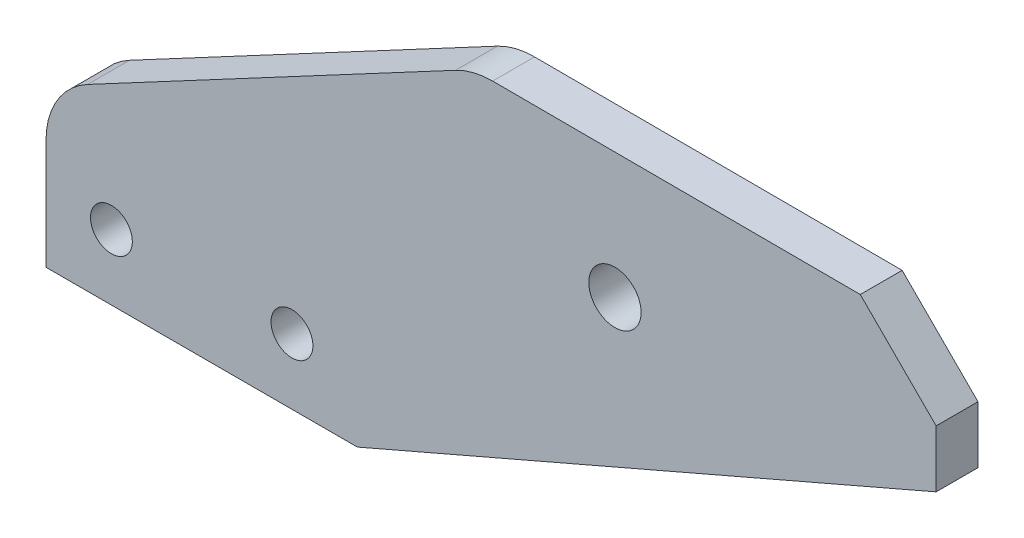
ISO-10303-21;
HEADER;
FILE_DESCRIPTION(('STEP AP214'),'2;1');
FILE_NAME('part.step','',(''),(''),'','','');
FILE_SCHEMA(('AUTOMOTIVE_DESIGN { 1 0 10303 214 1 1 1 1 }'));
ENDSEC;
DATA;
#1=APPLICATION_CONTEXT('core data for automotive mechanical design processes');
#2=APPLICATION_PROTOCOL_DEFINITION('international standard','automotive_design',2000,#1);
#3=PRODUCT_CONTEXT('',#1,'mechanical');
#4=PRODUCT('Part','Part','',(#3));
#5=PRODUCT_RELATED_PRODUCT_CATEGORY('part','',(#4));
#6=PRODUCT_DEFINITION_FORMATION('','',#4);
#7=PRODUCT_DEFINITION_CONTEXT('part definition',#1,'design');
#8=PRODUCT_DEFINITION('design','',#6,#7);
#9=PRODUCT_DEFINITION_SHAPE('','',#8);
#10=(LENGTH_UNIT() NAMED_UNIT(*) SI_UNIT(.MILLI.,.METRE.));
#11=(NAMED_UNIT(*) PLANE_ANGLE_UNIT() SI_UNIT($,.RADIAN.));
#12=(NAMED_UNIT(*) SI_UNIT($,.STERADIAN.) SOLID_ANGLE_UNIT());
#13=UNCERTAINTY_MEASURE_WITH_UNIT(LENGTH_MEASURE(1.E-05),#10,'distance_accuracy_value','');
#14=(GEOMETRIC_REPRESENTATION_CONTEXT(3) GLOBAL_UNCERTAINTY_ASSIGNED_CONTEXT((#13)) GLOBAL_UNIT_ASSIGNED_CONTEXT((#10,
#11,#12)) REPRESENTATION_CONTEXT('',''));
#15=CARTESIAN_POINT('',(0.,0.,0.));
#16=DIRECTION('',(0.,0.,1.));
#17=DIRECTION('',(1.,0.,0.));
#18=AXIS2_PLACEMENT_3D('',#15,#16,#17);
#19=CARTESIAN_POINT('',(0.,0.,-4.064));
#20=DIRECTION('',(0.,-1.,0.));
#21=DIRECTION('',(0.,0.,-1.));
#22=AXIS2_PLACEMENT_3D('',#19,#20,#21);
#23=PLANE('',#22);
#24=DIRECTION('',(1.,0.,0.));
#25=VECTOR('',#24,1.);
#26=CARTESIAN_POINT('',(0.,0.,0.));
#27=LINE('',#26,#25);
#28=CARTESIAN_POINT('',(0.,0.,0.));
#29=VERTEX_POINT('',#28);
#30=CARTESIAN_POINT('',(30.226,0.,0.));
#31=VERTEX_POINT('',#30);
#32=EDGE_CURVE('E142',#29,#31,#27,.T.);
#33=ORIENTED_EDGE('',*,*,#32,.F.);
#34=DIRECTION('',(0.,0.,1.));
#35=VECTOR('',#34,1.);
#36=CARTESIAN_POINT('',(0.,0.,-4.064));
#37=LINE('',#36,#35);
#38=CARTESIAN_POINT('',(0.,0.,-4.064));
#39=VERTEX_POINT('',#38);
#40=EDGE_CURVE('E11',#39,#29,#37,.T.);
#41=ORIENTED_EDGE('',*,*,#40,.F.);
#42=DIRECTION('',(1.,0.,0.));
#43=VECTOR('',#42,1.);
#44=CARTESIAN_POINT('',(0.,0.,-4.064));
#45=LINE('',#44,#43);
#46=CARTESIAN_POINT('',(30.226,0.,-4.064));
#47=VERTEX_POINT('',#46);
#48=EDGE_CURVE('E166',#39,#47,#45,.T.);
#49=ORIENTED_EDGE('',*,*,#48,.T.);
#50=DIRECTION('',(0.,0.,1.));
#51=VECTOR('',#50,1.);
#52=CARTESIAN_POINT('',(30.226,0.,-4.064));
#53=LINE('',#52,#51);
#54=EDGE_CURVE('E42',#47,#31,#53,.T.);
#55=ORIENTED_EDGE('',*,*,#54,.T.);
#56=EDGE_LOOP('',(#33,#41,#49,#55));
#57=FACE_BOUND('',#56,.T.);
#58=ADVANCED_FACE('F39',(#57),#23,.T.);
#59=CARTESIAN_POINT('',(0.,0.,-4.064));
#60=DIRECTION('',(-1.,0.,0.));
#61=DIRECTION('',(0.,0.,1.));
#62=AXIS2_PLACEMENT_3D('',#59,#60,#61);
#63=PLANE('',#62);
#64=DIRECTION('',(0.,-1.,0.));
#65=VECTOR('',#64,1.);
#66=CARTESIAN_POINT('',(0.,0.,0.));
#67=LINE('',#66,#65);
#68=CARTESIAN_POINT('',(0.,10.6678317662414,0.));
#69=VERTEX_POINT('',#68);
#70=EDGE_CURVE('E164',#69,#29,#67,.T.);
#71=ORIENTED_EDGE('',*,*,#70,.F.);
#72=DIRECTION('',(0.,0.,1.));
#73=VECTOR('',#72,1.);
#74=CARTESIAN_POINT('',(0.,10.6678317662414,-4.064));
#75=LINE('',#74,#73);
#76=CARTESIAN_POINT('',(0.,10.6678317662414,-4.064));
#77=VERTEX_POINT('',#76);
#78=EDGE_CURVE('E48',#77,#69,#75,.T.);
#79=ORIENTED_EDGE('',*,*,#78,.F.);
#80=DIRECTION('',(0.,-1.,0.));
#81=VECTOR('',#80,1.);
#82=CARTESIAN_POINT('',(0.,0.,-4.064));
#83=LINE('',#82,#81);
#84=EDGE_CURVE('E132',#77,#39,#83,.T.);
#85=ORIENTED_EDGE('',*,*,#84,.T.);
#86=ORIENTED_EDGE('',*,*,#40,.T.);
#87=EDGE_LOOP('',(#71,#79,#85,#86));
#88=FACE_BOUND('',#87,.T.);
#89=ADVANCED_FACE('F180',(#88),#63,.T.);
#90=CARTESIAN_POINT('',(7.62,10.6678317662414,-4.064));
#91=DIRECTION('',(0.,0.,1.));
#92=DIRECTION('',(1.,0.,0.));
#93=AXIS2_PLACEMENT_3D('',#90,#91,#92);
#94=CYLINDRICAL_SURFACE('',#93,7.62);
#95=CARTESIAN_POINT('',(7.62,10.6678317662414,0.));
#96=DIRECTION('',(0.,0.,1.));
#97=DIRECTION('',(-1.,0.,0.));
#98=AXIS2_PLACEMENT_3D('',#95,#96,#97);
#99=CIRCLE('',#98,7.62);
#100=CARTESIAN_POINT('',(4.03433594322211,17.3914775980748,0.));
#101=VERTEX_POINT('',#100);
#102=EDGE_CURVE('E119',#101,#69,#99,.T.);
#103=ORIENTED_EDGE('',*,*,#102,.F.);
#104=DIRECTION('',(0.,0.,1.));
#105=VECTOR('',#104,1.);
#106=CARTESIAN_POINT('',(4.03433594322211,17.3914775980748,-4.064));
#107=LINE('',#106,#105);
#108=CARTESIAN_POINT('',(4.03433594322211,17.3914775980748,-4.064));
#109=VERTEX_POINT('',#108);
#110=EDGE_CURVE('E114',#109,#101,#107,.T.);
#111=ORIENTED_EDGE('',*,*,#110,.F.);
#112=CARTESIAN_POINT('',(7.62,10.6678317662414,-4.064));
#113=DIRECTION('',(0.,0.,1.));
#114=DIRECTION('',(-1.,0.,0.));
#115=AXIS2_PLACEMENT_3D('',#112,#113,#114);
#116=CIRCLE('',#115,7.62);
#117=EDGE_CURVE('E117',#109,#77,#116,.T.);
#118=ORIENTED_EDGE('',*,*,#117,.T.);
#119=ORIENTED_EDGE('',*,*,#78,.T.);
#120=EDGE_LOOP('',(#103,#111,#118,#119));
#121=FACE_BOUND('',#120,.T.);
#122=ADVANCED_FACE('F116',(#121),#94,.T.);
#123=CARTESIAN_POINT('',(39.7559503073095,36.4415156100357,-4.064));
#124=DIRECTION('',(-0.470559587503661,0.882368219400713,0.));
#125=DIRECTION('',(-0.882368219400713,-0.470559587503661,0.));
#126=AXIS2_PLACEMENT_3D('',#123,#124,#125);
#127=PLANE('',#126);
#128=DIRECTION('',(-0.882368219400713,-0.470559587503661,0.));
#129=VECTOR('',#128,1.);
#130=CARTESIAN_POINT('',(39.7559503073095,36.4415156100357,0.));
#131=LINE('',#130,#129);
#132=CARTESIAN_POINT('',(39.7559503073095,36.4415156100357,0.));
#133=VERTEX_POINT('',#132);
#134=EDGE_CURVE('E161',#133,#101,#131,.T.);
#135=ORIENTED_EDGE('',*,*,#134,.F.);
#136=DIRECTION('',(0.,0.,1.));
#137=VECTOR('',#136,1.);
#138=CARTESIAN_POINT('',(39.7559503073095,36.4415156100357,-4.064));
#139=LINE('',#138,#137);
#140=CARTESIAN_POINT('',(39.7559503073095,36.4415156100357,-4.064));
#141=VERTEX_POINT('',#140);
#142=EDGE_CURVE('E124',#141,#133,#139,.T.);
#143=ORIENTED_EDGE('',*,*,#142,.F.);
#144=DIRECTION('',(-0.882368219400713,-0.470559587503661,0.));
#145=VECTOR('',#144,1.);
#146=CARTESIAN_POINT('',(39.7559503073095,36.4415156100357,-4.064));
#147=LINE('',#146,#145);
#148=EDGE_CURVE('E130',#141,#109,#147,.T.);
#149=ORIENTED_EDGE('',*,*,#148,.T.);
#150=ORIENTED_EDGE('',*,*,#110,.T.);
#151=EDGE_LOOP('',(#135,#143,#149,#150));
#152=FACE_BOUND('',#151,.T.);
#153=ADVANCED_FACE('F134',(#152),#127,.T.);
#154=CARTESIAN_POINT('',(43.3416143640874,29.7178697782022,-4.064));
#155=DIRECTION('',(0.,0.,1.));
#156=DIRECTION('',(1.,0.,0.));
#157=AXIS2_PLACEMENT_3D('',#154,#155,#156);
#158=CYLINDRICAL_SURFACE('',#157,7.62);
#159=CARTESIAN_POINT('',(43.3416143640874,29.7178697782022,0.));
#160=DIRECTION('',(0.,0.,1.));
#161=DIRECTION('',(-1.,0.,0.));
#162=AXIS2_PLACEMENT_3D('',#159,#160,#161);
#163=CIRCLE('',#162,7.62);
#164=CARTESIAN_POINT('',(43.3630430224177,37.337839647736,0.));
#165=VERTEX_POINT('',#164);
#166=EDGE_CURVE('E158',#165,#133,#163,.T.);
#167=ORIENTED_EDGE('',*,*,#166,.F.);
#168=DIRECTION('',(0.,0.,1.));
#169=VECTOR('',#168,1.);
#170=CARTESIAN_POINT('',(43.3630430224177,37.337839647736,-4.064));
#171=LINE('',#170,#169);
#172=CARTESIAN_POINT('',(43.3630430224177,37.337839647736,-4.064));
#173=VERTEX_POINT('',#172);
#174=EDGE_CURVE('E170',#173,#165,#171,.T.);
#175=ORIENTED_EDGE('',*,*,#174,.F.);
#176=CARTESIAN_POINT('',(43.3416143640874,29.7178697782022,-4.064));
#177=DIRECTION('',(0.,0.,1.));
#178=DIRECTION('',(-1.,0.,0.));
#179=AXIS2_PLACEMENT_3D('',#176,#177,#178);
#180=CIRCLE('',#179,7.62);
#181=EDGE_CURVE('E135',#173,#141,#180,.T.);
#182=ORIENTED_EDGE('',*,*,#181,.T.);
#183=ORIENTED_EDGE('',*,*,#142,.T.);
#184=EDGE_LOOP('',(#167,#175,#182,#183));
#185=FACE_BOUND('',#184,.T.);
#186=ADVANCED_FACE('F193',(#185),#158,.T.);
#187=CARTESIAN_POINT('',(79.0464141226986,37.2374919061473,-4.064));
#188=DIRECTION('',(0.00281215988586562,0.999996045870571,0.));
#189=DIRECTION('',(-0.999996045870571,0.00281215988586562,0.));
#190=AXIS2_PLACEMENT_3D('',#187,#188,#189);
#191=PLANE('',#190);
#192=DIRECTION('',(-0.999996045870571,0.00281215988586562,0.));
#193=VECTOR('',#192,1.);
#194=CARTESIAN_POINT('',(79.0464141226986,37.2374919061473,0.));
#195=LINE('',#194,#193);
#196=CARTESIAN_POINT('',(79.0464141226986,37.2374919061473,0.));
#197=VERTEX_POINT('',#196);
#198=EDGE_CURVE('E155',#197,#165,#195,.T.);
#199=ORIENTED_EDGE('',*,*,#198,.F.);
#200=DIRECTION('',(0.,0.,1.));
#201=VECTOR('',#200,1.);
#202=CARTESIAN_POINT('',(79.0464141226986,37.2374919061473,-4.064));
#203=LINE('',#202,#201);
#204=CARTESIAN_POINT('',(79.0464141226986,37.2374919061473,-4.064));
#205=VERTEX_POINT('',#204);
#206=EDGE_CURVE('E172',#205,#197,#203,.T.);
#207=ORIENTED_EDGE('',*,*,#206,.F.);
#208=DIRECTION('',(-0.999996045870571,0.00281215988586562,0.));
#209=VECTOR('',#208,1.);
#210=CARTESIAN_POINT('',(79.0464141226986,37.2374919061473,-4.064));
#211=LINE('',#210,#209);
#212=EDGE_CURVE('E137',#205,#173,#211,.T.);
#213=ORIENTED_EDGE('',*,*,#212,.T.);
#214=ORIENTED_EDGE('',*,*,#174,.T.);
#215=EDGE_LOOP('',(#199,#207,#213,#214));
#216=FACE_BOUND('',#215,.T.);
#217=ADVANCED_FACE('F196',(#216),#191,.T.);
#218=CARTESIAN_POINT('',(86.4102241419753,29.8736818868707,-4.064));
#219=DIRECTION('',(0.707106781186545,0.70710678118655,0.));
#220=DIRECTION('',(-0.70710678118655,0.707106781186545,0.));
#221=AXIS2_PLACEMENT_3D('',#218,#219,#220);
#222=PLANE('',#221);
#223=DIRECTION('',(-0.70710678118655,0.707106781186545,0.));
#224=VECTOR('',#223,1.);
#225=CARTESIAN_POINT('',(86.4102241419753,29.8736818868707,0.));
#226=LINE('',#225,#224);
#227=CARTESIAN_POINT('',(86.4102241419753,29.8736818868707,0.));
#228=VERTEX_POINT('',#227);
#229=EDGE_CURVE('E152',#228,#197,#226,.T.);
#230=ORIENTED_EDGE('',*,*,#229,.F.);
#231=DIRECTION('',(0.,0.,1.));
#232=VECTOR('',#231,1.);
#233=CARTESIAN_POINT('',(86.4102241419753,29.8736818868707,-4.064));
#234=LINE('',#233,#232);
#235=CARTESIAN_POINT('',(86.4102241419753,29.8736818868707,-4.064));
#236=VERTEX_POINT('',#235);
#237=EDGE_CURVE('E174',#236,#228,#234,.T.);
#238=ORIENTED_EDGE('',*,*,#237,.F.);
#239=DIRECTION('',(-0.70710678118655,0.707106781186545,0.));
#240=VECTOR('',#239,1.);
#241=CARTESIAN_POINT('',(86.4102241419753,29.8736818868707,-4.064));
#242=LINE('',#241,#240);
#243=EDGE_CURVE('E259',#236,#205,#242,.T.);
#244=ORIENTED_EDGE('',*,*,#243,.T.);
#245=ORIENTED_EDGE('',*,*,#206,.T.);
#246=EDGE_LOOP('',(#230,#238,#244,#245));
#247=FACE_BOUND('',#246,.T.);
#248=ADVANCED_FACE('F200',(#247),#222,.T.);
#249=CARTESIAN_POINT('',(86.4102241419753,24.3253035912332,-4.064));
#250=DIRECTION('',(1.,0.,0.));
#251=DIRECTION('',(0.,0.,-1.));
#252=AXIS2_PLACEMENT_3D('',#249,#250,#251);
#253=PLANE('',#252);
#254=DIRECTION('',(0.,1.,0.));
#255=VECTOR('',#254,1.);
#256=CARTESIAN_POINT('',(86.4102241419753,24.3253035912332,0.));
#257=LINE('',#256,#255);
#258=CARTESIAN_POINT('',(86.4102241419753,24.3253035912332,0.));
#259=VERTEX_POINT('',#258);
#260=EDGE_CURVE('E149',#259,#228,#257,.T.);
#261=ORIENTED_EDGE('',*,*,#260,.F.);
#262=DIRECTION('',(0.,0.,1.));
#263=VECTOR('',#262,1.);
#264=CARTESIAN_POINT('',(86.4102241419753,24.3253035912332,-4.064));
#265=LINE('',#264,#263);
#266=CARTESIAN_POINT('',(86.4102241419753,24.3253035912332,-4.064));
#267=VERTEX_POINT('',#266);
#268=EDGE_CURVE('E175',#267,#259,#265,.T.);
#269=ORIENTED_EDGE('',*,*,#268,.F.);
#270=DIRECTION('',(0.,1.,0.));
#271=VECTOR('',#270,1.);
#272=CARTESIAN_POINT('',(86.4102241419753,24.3253035912332,-4.064));
#273=LINE('',#272,#271);
#274=EDGE_CURVE('E256',#267,#236,#273,.T.);
#275=ORIENTED_EDGE('',*,*,#274,.T.);
#276=ORIENTED_EDGE('',*,*,#237,.T.);
#277=EDGE_LOOP('',(#261,#269,#275,#276));
#278=FACE_BOUND('',#277,.T.);
#279=ADVANCED_FACE('F204',(#278),#253,.T.);
#280=CARTESIAN_POINT('',(30.226,0.,-4.064));
#281=DIRECTION('',(0.397315979691373,-0.917681868776912,0.));
#282=DIRECTION('',(0.917681868776912,0.397315979691373,0.));
#283=AXIS2_PLACEMENT_3D('',#280,#281,#282);
#284=PLANE('',#283);
#285=DIRECTION('',(0.917681868776911,0.397315979691373,0.));
#286=VECTOR('',#285,1.);
#287=CARTESIAN_POINT('',(30.226,0.,0.));
#288=LINE('',#287,#286);
#289=EDGE_CURVE('E145',#31,#259,#288,.T.);
#290=ORIENTED_EDGE('',*,*,#289,.F.);
#291=ORIENTED_EDGE('',*,*,#54,.F.);
#292=DIRECTION('',(0.917681868776911,0.397315979691373,0.));
#293=VECTOR('',#292,1.);
#294=CARTESIAN_POINT('',(30.226,0.,-4.064));
#295=LINE('',#294,#293);
#296=EDGE_CURVE('E254',#47,#267,#295,.T.);
#297=ORIENTED_EDGE('',*,*,#296,.T.);
#298=ORIENTED_EDGE('',*,*,#268,.T.);
#299=EDGE_LOOP('',(#290,#291,#297,#298));
#300=FACE_BOUND('',#299,.T.);
#301=ADVANCED_FACE('F177',(#300),#284,.T.);
#302=CARTESIAN_POINT('',(43.3416143640874,29.7178697782022,-4.064));
#303=DIRECTION('',(0.,0.,-1.));
#304=DIRECTION('',(-1.,0.,0.));
#305=AXIS2_PLACEMENT_3D('',#302,#303,#304);
#306=PLANE('',#305);
#307=CARTESIAN_POINT('',(55.2307073632248,25.0857852639797,-4.064));
#308=DIRECTION('',(0.,0.,1.));
#309=DIRECTION('',(1.,0.,0.));
#310=AXIS2_PLACEMENT_3D('',#307,#308,#309);
#311=CIRCLE('',#310,2.54);
#312=CARTESIAN_POINT('',(57.7707073632248,25.0857852639797,-4.064));
#313=VERTEX_POINT('',#312);
#314=EDGE_CURVE('E235',#313,#313,#311,.T.);
#315=ORIENTED_EDGE('',*,*,#314,.T.);
#316=EDGE_LOOP('',(#315));
#317=FACE_BOUND('',#316,.T.);
#318=CARTESIAN_POINT('',(23.876,6.35,-4.064));
#319=DIRECTION('',(0.,0.,1.));
#320=DIRECTION('',(1.,0.,0.));
#321=AXIS2_PLACEMENT_3D('',#318,#319,#320);
#322=CIRCLE('',#321,2.032);
#323=CARTESIAN_POINT('',(25.908,6.35,-4.064));
#324=VERTEX_POINT('',#323);
#325=EDGE_CURVE('E243',#324,#324,#322,.T.);
#326=ORIENTED_EDGE('',*,*,#325,.T.);
#327=EDGE_LOOP('',(#326));
#328=FACE_BOUND('',#327,.T.);
#329=CARTESIAN_POINT('',(6.35,6.35,-4.064));
#330=DIRECTION('',(0.,0.,1.));
#331=DIRECTION('',(1.,0.,0.));
#332=AXIS2_PLACEMENT_3D('',#329,#330,#331);
#333=CIRCLE('',#332,2.032);
#334=CARTESIAN_POINT('',(8.382,6.35,-4.064));
#335=VERTEX_POINT('',#334);
#336=EDGE_CURVE('E146',#335,#335,#333,.T.);
#337=ORIENTED_EDGE('',*,*,#336,.T.);
#338=EDGE_LOOP('',(#337));
#339=FACE_BOUND('',#338,.T.);
#340=ORIENTED_EDGE('',*,*,#48,.F.);
#341=ORIENTED_EDGE('',*,*,#84,.F.);
#342=ORIENTED_EDGE('',*,*,#117,.F.);
#343=ORIENTED_EDGE('',*,*,#148,.F.);
#344=ORIENTED_EDGE('',*,*,#181,.F.);
#345=ORIENTED_EDGE('',*,*,#212,.F.);
#346=ORIENTED_EDGE('',*,*,#243,.F.);
#347=ORIENTED_EDGE('',*,*,#274,.F.);
#348=ORIENTED_EDGE('',*,*,#296,.F.);
#349=EDGE_LOOP('',(#340,#341,#342,#343,#344,#345,#346,#347,#348));
#350=FACE_BOUND('',#349,.T.);
#351=ADVANCED_FACE('F128',(#317,#328,#339,#350),#306,.T.);
#352=CARTESIAN_POINT('',(43.3416143640874,29.7178697782022,0.));
#353=DIRECTION('',(0.,0.,-1.));
#354=DIRECTION('',(-1.,0.,0.));
#355=AXIS2_PLACEMENT_3D('',#352,#353,#354);
#356=PLANE('',#355);
#357=CARTESIAN_POINT('',(55.2307073632248,25.0857852639797,0.));
#358=DIRECTION('',(0.,0.,1.));
#359=DIRECTION('',(1.,0.,0.));
#360=AXIS2_PLACEMENT_3D('',#357,#358,#359);
#361=CIRCLE('',#360,2.54);
#362=CARTESIAN_POINT('',(57.7707073632248,25.0857852639797,0.));
#363=VERTEX_POINT('',#362);
#364=EDGE_CURVE('E238',#363,#363,#361,.T.);
#365=ORIENTED_EDGE('',*,*,#364,.F.);
#366=EDGE_LOOP('',(#365));
#367=FACE_BOUND('',#366,.T.);
#368=CARTESIAN_POINT('',(23.876,6.35,0.));
#369=DIRECTION('',(0.,0.,1.));
#370=DIRECTION('',(1.,0.,0.));
#371=AXIS2_PLACEMENT_3D('',#368,#369,#370);
#372=CIRCLE('',#371,2.032);
#373=CARTESIAN_POINT('',(25.908,6.35,0.));
#374=VERTEX_POINT('',#373);
#375=EDGE_CURVE('E240',#374,#374,#372,.T.);
#376=ORIENTED_EDGE('',*,*,#375,.F.);
#377=EDGE_LOOP('',(#376));
#378=FACE_BOUND('',#377,.T.);
#379=CARTESIAN_POINT('',(6.35,6.35,0.));
#380=DIRECTION('',(0.,0.,1.));
#381=DIRECTION('',(1.,0.,0.));
#382=AXIS2_PLACEMENT_3D('',#379,#380,#381);
#383=CIRCLE('',#382,2.032);
#384=CARTESIAN_POINT('',(8.382,6.35,0.));
#385=VERTEX_POINT('',#384);
#386=EDGE_CURVE('E246',#385,#385,#383,.T.);
#387=ORIENTED_EDGE('',*,*,#386,.F.);
#388=EDGE_LOOP('',(#387));
#389=FACE_BOUND('',#388,.T.);
#390=ORIENTED_EDGE('',*,*,#32,.T.);
#391=ORIENTED_EDGE('',*,*,#289,.T.);
#392=ORIENTED_EDGE('',*,*,#260,.T.);
#393=ORIENTED_EDGE('',*,*,#229,.T.);
#394=ORIENTED_EDGE('',*,*,#198,.T.);
#395=ORIENTED_EDGE('',*,*,#166,.T.);
#396=ORIENTED_EDGE('',*,*,#134,.T.);
#397=ORIENTED_EDGE('',*,*,#102,.T.);
#398=ORIENTED_EDGE('',*,*,#70,.T.);
#399=EDGE_LOOP('',(#390,#391,#392,#393,#394,#395,#396,#397,#398));
#400=FACE_BOUND('',#399,.T.);
#401=ADVANCED_FACE('F179',(#367,#378,#389,#400),#356,.F.);
#402=CARTESIAN_POINT('',(6.35,6.35,-4.064));
#403=DIRECTION('',(0.,0.,1.));
#404=DIRECTION('',(1.,0.,0.));
#405=AXIS2_PLACEMENT_3D('',#402,#403,#404);
#406=CYLINDRICAL_SURFACE('',#405,2.032);
#407=ORIENTED_EDGE('',*,*,#336,.F.);
#408=EDGE_LOOP('',(#407));
#409=FACE_BOUND('',#408,.T.);
#410=ORIENTED_EDGE('',*,*,#386,.T.);
#411=EDGE_LOOP('',(#410));
#412=FACE_BOUND('',#411,.T.);
#413=ADVANCED_FACE('F216',(#409,#412),#406,.F.);
#414=CARTESIAN_POINT('',(23.876,6.35,-4.064));
#415=DIRECTION('',(0.,0.,1.));
#416=DIRECTION('',(1.,0.,0.));
#417=AXIS2_PLACEMENT_3D('',#414,#415,#416);
#418=CYLINDRICAL_SURFACE('',#417,2.032);
#419=ORIENTED_EDGE('',*,*,#325,.F.);
#420=EDGE_LOOP('',(#419));
#421=FACE_BOUND('',#420,.T.);
#422=ORIENTED_EDGE('',*,*,#375,.T.);
#423=EDGE_LOOP('',(#422));
#424=FACE_BOUND('',#423,.T.);
#425=ADVANCED_FACE('F223',(#421,#424),#418,.F.);
#426=CARTESIAN_POINT('',(55.2307073632248,25.0857852639797,-4.064));
#427=DIRECTION('',(0.,0.,1.));
#428=DIRECTION('',(1.,0.,0.));
#429=AXIS2_PLACEMENT_3D('',#426,#427,#428);
#430=CYLINDRICAL_SURFACE('',#429,2.54);
#431=ORIENTED_EDGE('',*,*,#314,.F.);
#432=EDGE_LOOP('',(#431));
#433=FACE_BOUND('',#432,.T.);
#434=ORIENTED_EDGE('',*,*,#364,.T.);
#435=EDGE_LOOP('',(#434));
#436=FACE_BOUND('',#435,.T.);
#437=ADVANCED_FACE('F227',(#433,#436),#430,.F.);
#438=CLOSED_SHELL('',(#58,#89,#122,#153,#186,#217,#248,#279,#301,#351,#401,#413,#425,#437));
#439=MANIFOLD_SOLID_BREP('B2',#438);
#440=ADVANCED_BREP_SHAPE_REPRESENTATION('',(#18,#439),#14);
#441=SHAPE_DEFINITION_REPRESENTATION(#9,#440);
ENDSEC;
END-ISO-10303-21;
